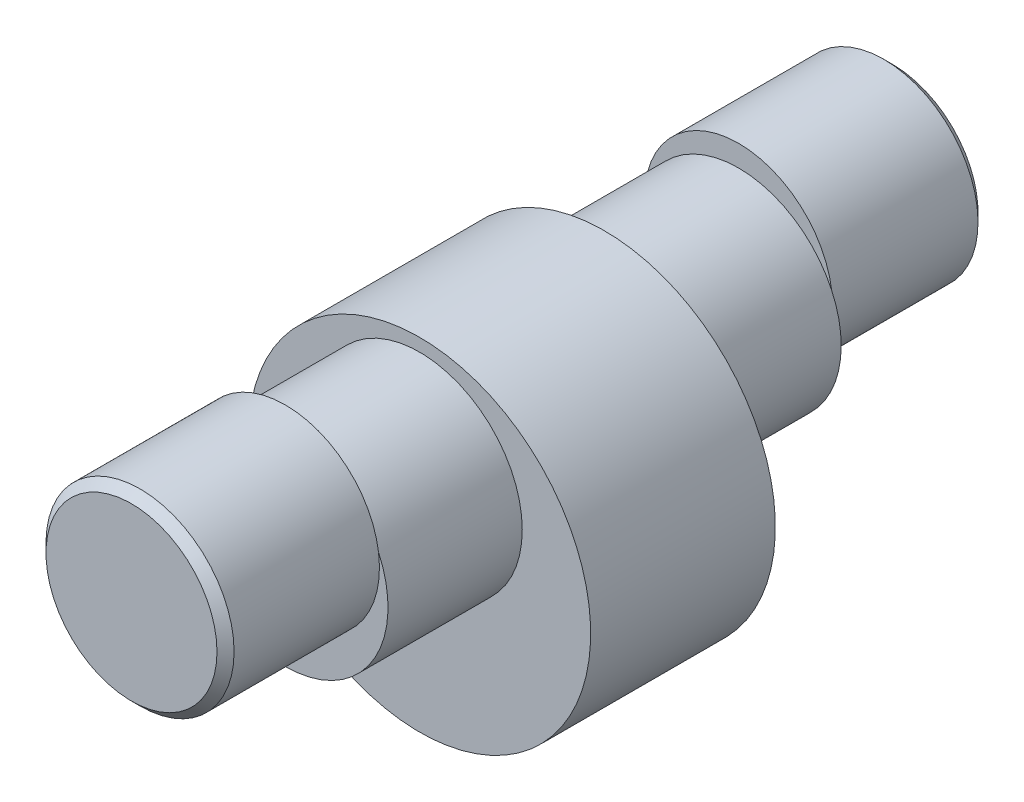
ISO-10303-21;
HEADER;
FILE_DESCRIPTION(('STEP AP214'),'2;1');
FILE_NAME('part.step','',(''),(''),'','','');
FILE_SCHEMA(('AUTOMOTIVE_DESIGN { 1 0 10303 214 1 1 1 1 }'));
ENDSEC;
DATA;
#1=APPLICATION_CONTEXT('core data for automotive mechanical design processes');
#2=APPLICATION_PROTOCOL_DEFINITION('international standard','automotive_design',2000,#1);
#3=PRODUCT_CONTEXT('',#1,'mechanical');
#4=PRODUCT('Part','Part','',(#3));
#5=PRODUCT_RELATED_PRODUCT_CATEGORY('part','',(#4));
#6=PRODUCT_DEFINITION_FORMATION('','',#4);
#7=PRODUCT_DEFINITION_CONTEXT('part definition',#1,'design');
#8=PRODUCT_DEFINITION('design','',#6,#7);
#9=PRODUCT_DEFINITION_SHAPE('','',#8);
#10=(LENGTH_UNIT() NAMED_UNIT(*) SI_UNIT(.MILLI.,.METRE.));
#11=(NAMED_UNIT(*) PLANE_ANGLE_UNIT() SI_UNIT($,.RADIAN.));
#12=(NAMED_UNIT(*) SI_UNIT($,.STERADIAN.) SOLID_ANGLE_UNIT());
#13=UNCERTAINTY_MEASURE_WITH_UNIT(LENGTH_MEASURE(1.E-05),#10,'distance_accuracy_value','');
#14=(GEOMETRIC_REPRESENTATION_CONTEXT(3) GLOBAL_UNCERTAINTY_ASSIGNED_CONTEXT((#13)) GLOBAL_UNIT_ASSIGNED_CONTEXT((#10,
#11,#12)) REPRESENTATION_CONTEXT('',''));
#15=CARTESIAN_POINT('',(0.,0.,0.));
#16=DIRECTION('',(0.,0.,1.));
#17=DIRECTION('',(1.,0.,0.));
#18=AXIS2_PLACEMENT_3D('',#15,#16,#17);
#19=CARTESIAN_POINT('',(0.,6.5,-26.5));
#20=DIRECTION('',(0.,0.,-1.));
#21=DIRECTION('',(1.,0.,0.));
#22=AXIS2_PLACEMENT_3D('',#19,#20,#21);
#23=PLANE('',#22);
#24=CARTESIAN_POINT('',(0.,6.5,-26.5));
#25=DIRECTION('',(0.,0.,1.));
#26=DIRECTION('',(1.,0.,0.));
#27=AXIS2_PLACEMENT_3D('',#24,#25,#26);
#28=CIRCLE('',#27,12.);
#29=CARTESIAN_POINT('',(-10.8922716470281,11.5357142857143,-26.5));
#30=VERTEX_POINT('',#29);
#31=CARTESIAN_POINT('',(10.8922716470281,11.5357142857143,-26.5));
#32=VERTEX_POINT('',#31);
#33=EDGE_CURVE('E71',#30,#32,#28,.T.);
#34=ORIENTED_EDGE('',*,*,#33,.F.);
#35=CARTESIAN_POINT('',(0.,10.,-26.5));
#36=DIRECTION('',(0.,0.,1.));
#37=DIRECTION('',(1.,0.,0.));
#38=AXIS2_PLACEMENT_3D('',#35,#36,#37);
#39=CIRCLE('',#38,11.);
#40=EDGE_CURVE('E59',#30,#32,#39,.T.);
#41=ORIENTED_EDGE('',*,*,#40,.T.);
#42=EDGE_LOOP('',(#34,#41));
#43=FACE_BOUND('',#42,.T.);
#44=ADVANCED_FACE('F31',(#43),#23,.T.);
#45=CARTESIAN_POINT('',(0.,0.,10.8));
#46=DIRECTION('',(0.,0.,1.));
#47=DIRECTION('',(1.,0.,0.));
#48=AXIS2_PLACEMENT_3D('',#45,#46,#47);
#49=PLANE('',#48);
#50=CARTESIAN_POINT('',(0.,0.,10.8));
#51=DIRECTION('',(0.,0.,1.));
#52=DIRECTION('',(1.,0.,0.));
#53=AXIS2_PLACEMENT_3D('',#50,#51,#52);
#54=CIRCLE('',#53,20.);
#55=CARTESIAN_POINT('',(-20.,0.,10.8));
#56=VERTEX_POINT('',#55);
#57=EDGE_CURVE('E90',#56,#56,#54,.T.);
#58=ORIENTED_EDGE('',*,*,#57,.T.);
#59=EDGE_LOOP('',(#58));
#60=FACE_BOUND('',#59,.T.);
#61=CARTESIAN_POINT('',(0.,6.5,10.8));
#62=DIRECTION('',(0.,0.,1.));
#63=DIRECTION('',(1.,0.,0.));
#64=AXIS2_PLACEMENT_3D('',#61,#62,#63);
#65=CIRCLE('',#64,12.);
#66=CARTESIAN_POINT('',(12.,6.5,10.8));
#67=VERTEX_POINT('',#66);
#68=EDGE_CURVE('E78',#67,#67,#65,.T.);
#69=ORIENTED_EDGE('',*,*,#68,.F.);
#70=EDGE_LOOP('',(#69));
#71=FACE_BOUND('',#70,.T.);
#72=ADVANCED_FACE('F112',(#60,#71),#49,.T.);
#73=CARTESIAN_POINT('',(0.,0.,10.8));
#74=DIRECTION('',(0.,0.,-1.));
#75=DIRECTION('',(-1.,0.,0.));
#76=AXIS2_PLACEMENT_3D('',#73,#74,#75);
#77=CYLINDRICAL_SURFACE('',#76,20.);
#78=CARTESIAN_POINT('',(0.,0.,-10.8));
#79=DIRECTION('',(0.,0.,1.));
#80=DIRECTION('',(1.,0.,0.));
#81=AXIS2_PLACEMENT_3D('',#78,#79,#80);
#82=CIRCLE('',#81,20.);
#83=CARTESIAN_POINT('',(-20.,0.,-10.8));
#84=VERTEX_POINT('',#83);
#85=EDGE_CURVE('E86',#84,#84,#82,.T.);
#86=CARTESIAN_POINT('',(-20.,0.,10.8));
#87=CARTESIAN_POINT('',(-20.,0.,10.575));
#88=CARTESIAN_POINT('',(-20.,0.,10.35));
#89=CARTESIAN_POINT('',(-20.,0.,9.9));
#90=CARTESIAN_POINT('',(-20.,0.,9.675));
#91=CARTESIAN_POINT('',(-20.,0.,9.225));
#92=CARTESIAN_POINT('',(-20.,0.,9.));
#93=CARTESIAN_POINT('',(-20.,0.,8.55));
#94=CARTESIAN_POINT('',(-20.,0.,8.325));
#95=CARTESIAN_POINT('',(-20.,0.,7.875));
#96=CARTESIAN_POINT('',(-20.,0.,7.65));
#97=CARTESIAN_POINT('',(-20.,0.,7.2));
#98=CARTESIAN_POINT('',(-20.,0.,6.975));
#99=CARTESIAN_POINT('',(-20.,0.,6.525));
#100=CARTESIAN_POINT('',(-20.,0.,6.3));
#101=CARTESIAN_POINT('',(-20.,0.,5.85));
#102=CARTESIAN_POINT('',(-20.,0.,5.625));
#103=CARTESIAN_POINT('',(-20.,0.,5.175));
#104=CARTESIAN_POINT('',(-20.,0.,4.95));
#105=CARTESIAN_POINT('',(-20.,0.,4.5));
#106=CARTESIAN_POINT('',(-20.,0.,4.275));
#107=CARTESIAN_POINT('',(-20.,0.,3.825));
#108=CARTESIAN_POINT('',(-20.,0.,3.6));
#109=CARTESIAN_POINT('',(-20.,0.,3.15));
#110=CARTESIAN_POINT('',(-20.,0.,2.925));
#111=CARTESIAN_POINT('',(-20.,0.,2.475));
#112=CARTESIAN_POINT('',(-20.,0.,2.25));
#113=CARTESIAN_POINT('',(-20.,0.,1.8));
#114=CARTESIAN_POINT('',(-20.,0.,1.575));
#115=CARTESIAN_POINT('',(-20.,0.,1.125));
#116=CARTESIAN_POINT('',(-20.,0.,0.899999999999997));
#117=CARTESIAN_POINT('',(-20.,0.,0.449999999999997));
#118=CARTESIAN_POINT('',(-20.,0.,0.224999999999997));
#119=CARTESIAN_POINT('',(-20.,0.,-0.225000000000004));
#120=CARTESIAN_POINT('',(-20.,0.,-0.450000000000004));
#121=CARTESIAN_POINT('',(-20.,0.,-0.900000000000004));
#122=CARTESIAN_POINT('',(-20.,0.,-1.125));
#123=CARTESIAN_POINT('',(-20.,0.,-1.575));
#124=CARTESIAN_POINT('',(-20.,0.,-1.8));
#125=CARTESIAN_POINT('',(-20.,0.,-2.25));
#126=CARTESIAN_POINT('',(-20.,0.,-2.475));
#127=CARTESIAN_POINT('',(-20.,0.,-2.925));
#128=CARTESIAN_POINT('',(-20.,0.,-3.15));
#129=CARTESIAN_POINT('',(-20.,0.,-3.6));
#130=CARTESIAN_POINT('',(-20.,0.,-3.82500000000001));
#131=CARTESIAN_POINT('',(-20.,0.,-4.27500000000001));
#132=CARTESIAN_POINT('',(-20.,0.,-4.5));
#133=CARTESIAN_POINT('',(-20.,0.,-4.95));
#134=CARTESIAN_POINT('',(-20.,0.,-5.175));
#135=CARTESIAN_POINT('',(-20.,0.,-5.625));
#136=CARTESIAN_POINT('',(-20.,0.,-5.85));
#137=CARTESIAN_POINT('',(-20.,0.,-6.3));
#138=CARTESIAN_POINT('',(-20.,0.,-6.525));
#139=CARTESIAN_POINT('',(-20.,0.,-6.975));
#140=CARTESIAN_POINT('',(-20.,0.,-7.2));
#141=CARTESIAN_POINT('',(-20.,0.,-7.65));
#142=CARTESIAN_POINT('',(-20.,0.,-7.875));
#143=CARTESIAN_POINT('',(-20.,0.,-8.325));
#144=CARTESIAN_POINT('',(-20.,0.,-8.55));
#145=CARTESIAN_POINT('',(-20.,0.,-9.00000000000001));
#146=CARTESIAN_POINT('',(-20.,0.,-9.225));
#147=CARTESIAN_POINT('',(-20.,0.,-9.675));
#148=CARTESIAN_POINT('',(-20.,0.,-9.9));
#149=CARTESIAN_POINT('',(-20.,0.,-10.35));
#150=CARTESIAN_POINT('',(-20.,0.,-10.575));
#151=CARTESIAN_POINT('',(-20.,0.,-10.8));
#152=B_SPLINE_CURVE_WITH_KNOTS('',3,(#86,#87,#88,#89,#90,#91,#92,#93,#94,#95,#96,#97,#98,#99,
#100,#101,#102,#103,#104,#105,#106,#107,#108,#109,#110,#111,#112,#113,#114,#115,#116,#117,#118,
#119,#120,#121,#122,#123,#124,#125,#126,#127,#128,#129,#130,#131,#132,#133,#134,#135,#136,#137,
#138,#139,#140,#141,#142,#143,#144,#145,#146,#147,#148,#149,#150,#151),.UNSPECIFIED.,.F.,.F.,(4,
2,2,2,2,2,2,2,2,2,2,2,2,2,2,2,2,2,2,2,2,2,2,2,2,2,2,2,2,2,2,2,4),(0.,0.674999999999998,1.35,
2.025,2.7,3.375,4.05,4.725,5.4,6.075,6.75,7.425,8.1,8.775,9.45,10.125,10.8,11.475,12.15,12.825,
13.5,14.175,14.85,15.525,16.2,16.875,17.55,18.225,18.9,19.575,20.25,20.925,21.6),.UNSPECIFIED.);
#153=EDGE_CURVE('BSEAM117',#56,#84,#152,.T.);
#154=ORIENTED_EDGE('',*,*,#57,.F.);
#155=ORIENTED_EDGE('',*,*,#85,.T.);
#156=ORIENTED_EDGE('',*,*,#153,.T.);
#157=ORIENTED_EDGE('',*,*,#153,.F.);
#158=EDGE_LOOP('',(#154,#156,#155,#157));
#159=FACE_BOUND('',#158,.T.);
#160=ADVANCED_FACE('F117',(#159),#77,.T.);
#161=CARTESIAN_POINT('',(0.,0.,-10.8));
#162=DIRECTION('',(0.,0.,1.));
#163=DIRECTION('',(1.,0.,0.));
#164=AXIS2_PLACEMENT_3D('',#161,#162,#163);
#165=PLANE('',#164);
#166=CARTESIAN_POINT('',(0.,6.5,-10.8));
#167=DIRECTION('',(0.,0.,1.));
#168=DIRECTION('',(1.,0.,0.));
#169=AXIS2_PLACEMENT_3D('',#166,#167,#168);
#170=CIRCLE('',#169,12.);
#171=CARTESIAN_POINT('',(12.,6.5,-10.8));
#172=VERTEX_POINT('',#171);
#173=EDGE_CURVE('E70',#172,#172,#170,.T.);
#174=ORIENTED_EDGE('',*,*,#173,.T.);
#175=EDGE_LOOP('',(#174));
#176=FACE_BOUND('',#175,.T.);
#177=ORIENTED_EDGE('',*,*,#85,.F.);
#178=EDGE_LOOP('',(#177));
#179=FACE_BOUND('',#178,.T.);
#180=ADVANCED_FACE('F142',(#176,#179),#165,.F.);
#181=CARTESIAN_POINT('',(0.,6.5,26.5));
#182=DIRECTION('',(0.,0.,-1.));
#183=DIRECTION('',(-1.,0.,0.));
#184=AXIS2_PLACEMENT_3D('',#181,#182,#183);
#185=CYLINDRICAL_SURFACE('',#184,12.);
#186=CARTESIAN_POINT('',(0.,6.5,26.5));
#187=DIRECTION('',(0.,0.,1.));
#188=DIRECTION('',(1.,0.,0.));
#189=AXIS2_PLACEMENT_3D('',#186,#187,#188);
#190=CIRCLE('',#189,12.);
#191=CARTESIAN_POINT('',(10.8922716470281,11.5357142857143,26.5));
#192=VERTEX_POINT('',#191);
#193=CARTESIAN_POINT('',(-10.8922716470281,11.5357142857143,26.5));
#194=VERTEX_POINT('',#193);
#195=EDGE_CURVE('E83',#192,#194,#190,.T.);
#196=ORIENTED_EDGE('',*,*,#195,.F.);
#197=EDGE_CURVE('E87',#194,#192,#190,.T.);
#198=ORIENTED_EDGE('',*,*,#197,.F.);
#199=EDGE_LOOP('',(#196,#198));
#200=FACE_BOUND('',#199,.T.);
#201=ORIENTED_EDGE('',*,*,#68,.T.);
#202=EDGE_LOOP('',(#201));
#203=FACE_BOUND('',#202,.T.);
#204=ADVANCED_FACE('F140',(#200,#203),#185,.T.);
#205=CARTESIAN_POINT('',(0.,6.5,26.5));
#206=DIRECTION('',(0.,0.,1.));
#207=DIRECTION('',(1.,0.,0.));
#208=AXIS2_PLACEMENT_3D('',#205,#206,#207);
#209=PLANE('',#208);
#210=CARTESIAN_POINT('',(0.,10.,26.5));
#211=DIRECTION('',(0.,0.,1.));
#212=DIRECTION('',(1.,0.,0.));
#213=AXIS2_PLACEMENT_3D('',#210,#211,#212);
#214=CIRCLE('',#213,11.);
#215=EDGE_CURVE('E52',#194,#192,#214,.T.);
#216=ORIENTED_EDGE('',*,*,#215,.F.);
#217=ORIENTED_EDGE('',*,*,#197,.T.);
#218=EDGE_LOOP('',(#216,#217));
#219=FACE_BOUND('',#218,.T.);
#220=ADVANCED_FACE('F133',(#219),#209,.T.);
#221=CARTESIAN_POINT('',(0.,10.,26.5));
#222=DIRECTION('',(0.,0.,1.));
#223=DIRECTION('',(1.,0.,0.));
#224=AXIS2_PLACEMENT_3D('',#221,#222,#223);
#225=PLANE('',#224);
#226=EDGE_CURVE('E76',#192,#194,#214,.T.);
#227=ORIENTED_EDGE('',*,*,#226,.F.);
#228=ORIENTED_EDGE('',*,*,#195,.T.);
#229=EDGE_LOOP('',(#227,#228));
#230=FACE_BOUND('',#229,.T.);
#231=ADVANCED_FACE('F130',(#230),#225,.F.);
#232=CARTESIAN_POINT('',(0.,10.,44.5));
#233=DIRECTION('',(0.,0.,-1.));
#234=DIRECTION('',(-1.,0.,0.));
#235=AXIS2_PLACEMENT_3D('',#232,#233,#234);
#236=CYLINDRICAL_SURFACE('',#235,11.);
#237=CARTESIAN_POINT('',(0.,10.,43.5));
#238=DIRECTION('',(0.,0.,1.));
#239=DIRECTION('',(1.,0.,0.));
#240=AXIS2_PLACEMENT_3D('',#237,#238,#239);
#241=CIRCLE('',#240,11.);
#242=CARTESIAN_POINT('',(11.,10.,43.5));
#243=VERTEX_POINT('',#242);
#244=EDGE_CURVE('E64',#243,#243,#241,.F.);
#245=ORIENTED_EDGE('',*,*,#244,.T.);
#246=EDGE_LOOP('',(#245));
#247=FACE_BOUND('',#246,.T.);
#248=ORIENTED_EDGE('',*,*,#226,.T.);
#249=ORIENTED_EDGE('',*,*,#215,.T.);
#250=EDGE_LOOP('',(#248,#249));
#251=FACE_BOUND('',#250,.T.);
#252=ADVANCED_FACE('F128',(#247,#251),#236,.T.);
#253=CARTESIAN_POINT('',(0.,10.,44.5));
#254=DIRECTION('',(0.,0.,1.));
#255=DIRECTION('',(1.,0.,0.));
#256=AXIS2_PLACEMENT_3D('',#253,#254,#255);
#257=PLANE('',#256);
#258=CARTESIAN_POINT('',(0.,10.,44.5));
#259=DIRECTION('',(0.,0.,1.));
#260=DIRECTION('',(1.,0.,0.));
#261=AXIS2_PLACEMENT_3D('',#258,#259,#260);
#262=CIRCLE('',#261,10.);
#263=CARTESIAN_POINT('',(10.,10.,44.5));
#264=VERTEX_POINT('',#263);
#265=EDGE_CURVE('E95',#264,#264,#262,.T.);
#266=ORIENTED_EDGE('',*,*,#265,.T.);
#267=EDGE_LOOP('',(#266));
#268=FACE_BOUND('',#267,.T.);
#269=ADVANCED_FACE('F125',(#268),#257,.T.);
#270=CARTESIAN_POINT('',(0.,10.,44.5));
#271=DIRECTION('',(0.,0.,-1.));
#272=DIRECTION('',(-1.,0.,0.));
#273=AXIS2_PLACEMENT_3D('',#270,#271,#272);
#274=CONICAL_SURFACE('',#273,10.,0.785398163397447);
#275=ORIENTED_EDGE('',*,*,#244,.F.);
#276=EDGE_LOOP('',(#275));
#277=FACE_BOUND('',#276,.T.);
#278=ORIENTED_EDGE('',*,*,#265,.F.);
#279=EDGE_LOOP('',(#278));
#280=FACE_BOUND('',#279,.T.);
#281=ADVANCED_FACE('F124',(#277,#280),#274,.T.);
#282=CARTESIAN_POINT('',(0.,6.5,-26.5));
#283=DIRECTION('',(0.,0.,1.));
#284=DIRECTION('',(1.,0.,0.));
#285=AXIS2_PLACEMENT_3D('',#282,#283,#284);
#286=CYLINDRICAL_SURFACE('',#285,12.);
#287=EDGE_CURVE('E69',#32,#30,#28,.T.);
#288=ORIENTED_EDGE('',*,*,#287,.T.);
#289=ORIENTED_EDGE('',*,*,#33,.T.);
#290=EDGE_LOOP('',(#288,#289));
#291=FACE_BOUND('',#290,.T.);
#292=ORIENTED_EDGE('',*,*,#173,.F.);
#293=EDGE_LOOP('',(#292));
#294=FACE_BOUND('',#293,.T.);
#295=ADVANCED_FACE('F74',(#291,#294),#286,.T.);
#296=CARTESIAN_POINT('',(0.,10.,-44.5));
#297=DIRECTION('',(0.,0.,1.));
#298=DIRECTION('',(1.,0.,0.));
#299=AXIS2_PLACEMENT_3D('',#296,#297,#298);
#300=CYLINDRICAL_SURFACE('',#299,11.);
#301=CARTESIAN_POINT('',(0.,10.,-43.5));
#302=DIRECTION('',(0.,0.,-1.));
#303=DIRECTION('',(-1.,0.,0.));
#304=AXIS2_PLACEMENT_3D('',#301,#302,#303);
#305=CIRCLE('',#304,11.);
#306=CARTESIAN_POINT('',(-11.,10.,-43.5));
#307=VERTEX_POINT('',#306);
#308=EDGE_CURVE('E39',#307,#307,#305,.F.);
#309=ORIENTED_EDGE('',*,*,#308,.T.);
#310=EDGE_LOOP('',(#309));
#311=FACE_BOUND('',#310,.T.);
#312=EDGE_CURVE('E45',#32,#30,#39,.T.);
#313=ORIENTED_EDGE('',*,*,#312,.F.);
#314=ORIENTED_EDGE('',*,*,#40,.F.);
#315=EDGE_LOOP('',(#313,#314));
#316=FACE_BOUND('',#315,.T.);
#317=ADVANCED_FACE('F60',(#311,#316),#300,.T.);
#318=CARTESIAN_POINT('',(0.,10.,-44.5));
#319=DIRECTION('',(0.,0.,-1.));
#320=DIRECTION('',(1.,0.,0.));
#321=AXIS2_PLACEMENT_3D('',#318,#319,#320);
#322=PLANE('',#321);
#323=CARTESIAN_POINT('',(0.,10.,-44.5));
#324=DIRECTION('',(0.,0.,-1.));
#325=DIRECTION('',(-1.,0.,0.));
#326=AXIS2_PLACEMENT_3D('',#323,#324,#325);
#327=CIRCLE('',#326,9.99999999999999);
#328=CARTESIAN_POINT('',(-9.99999999999999,10.,-44.5));
#329=VERTEX_POINT('',#328);
#330=EDGE_CURVE('E11',#329,#329,#327,.T.);
#331=ORIENTED_EDGE('',*,*,#330,.T.);
#332=EDGE_LOOP('',(#331));
#333=FACE_BOUND('',#332,.T.);
#334=ADVANCED_FACE('F108',(#333),#322,.T.);
#335=CARTESIAN_POINT('',(0.,10.,-26.5));
#336=DIRECTION('',(0.,0.,-1.));
#337=DIRECTION('',(1.,0.,0.));
#338=AXIS2_PLACEMENT_3D('',#335,#336,#337);
#339=PLANE('',#338);
#340=ORIENTED_EDGE('',*,*,#287,.F.);
#341=ORIENTED_EDGE('',*,*,#312,.T.);
#342=EDGE_LOOP('',(#340,#341));
#343=FACE_BOUND('',#342,.T.);
#344=ADVANCED_FACE('F67',(#343),#339,.F.);
#345=CARTESIAN_POINT('',(0.,10.,-43.5));
#346=DIRECTION('',(0.,0.,1.));
#347=DIRECTION('',(1.,0.,0.));
#348=AXIS2_PLACEMENT_3D('',#345,#346,#347);
#349=CONICAL_SURFACE('',#348,11.,0.785398163397443);
#350=ORIENTED_EDGE('',*,*,#330,.F.);
#351=EDGE_LOOP('',(#350));
#352=FACE_BOUND('',#351,.T.);
#353=ORIENTED_EDGE('',*,*,#308,.F.);
#354=EDGE_LOOP('',(#353));
#355=FACE_BOUND('',#354,.T.);
#356=ADVANCED_FACE('F33',(#352,#355),#349,.T.);
#357=CLOSED_SHELL('',(#44,#72,#160,#180,#204,#220,#231,#252,#269,#281,#295,#317,#334,#344,#356));
#358=MANIFOLD_SOLID_BREP('B2',#357);
#359=ADVANCED_BREP_SHAPE_REPRESENTATION('',(#18,#358),#14);
#360=SHAPE_DEFINITION_REPRESENTATION(#9,#359);
ENDSEC;
END-ISO-10303-21;
